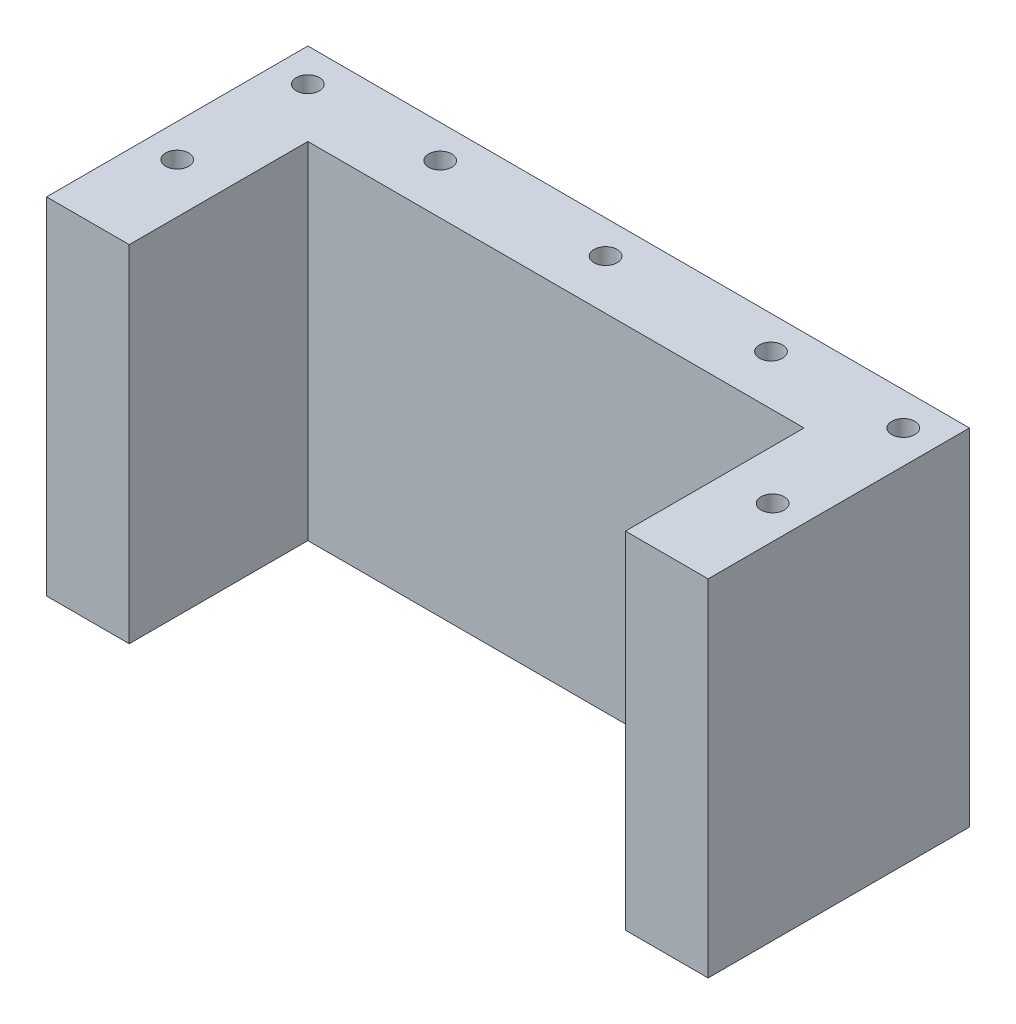
ISO-10303-21;
HEADER;
FILE_DESCRIPTION(('STEP AP214'),'2;1');
FILE_NAME('part.step','',(''),(''),'','','');
FILE_SCHEMA(('AUTOMOTIVE_DESIGN { 1 0 10303 214 1 1 1 1 }'));
ENDSEC;
DATA;
#1=APPLICATION_CONTEXT('core data for automotive mechanical design processes');
#2=APPLICATION_PROTOCOL_DEFINITION('international standard','automotive_design',2000,#1);
#3=PRODUCT_CONTEXT('',#1,'mechanical');
#4=PRODUCT('Part','Part','',(#3));
#5=PRODUCT_RELATED_PRODUCT_CATEGORY('part','',(#4));
#6=PRODUCT_DEFINITION_FORMATION('','',#4);
#7=PRODUCT_DEFINITION_CONTEXT('part definition',#1,'design');
#8=PRODUCT_DEFINITION('design','',#6,#7);
#9=PRODUCT_DEFINITION_SHAPE('','',#8);
#10=(LENGTH_UNIT() NAMED_UNIT(*) SI_UNIT(.MILLI.,.METRE.));
#11=(NAMED_UNIT(*) PLANE_ANGLE_UNIT() SI_UNIT($,.RADIAN.));
#12=(NAMED_UNIT(*) SI_UNIT($,.STERADIAN.) SOLID_ANGLE_UNIT());
#13=UNCERTAINTY_MEASURE_WITH_UNIT(LENGTH_MEASURE(1.E-05),#10,'distance_accuracy_value','');
#14=(GEOMETRIC_REPRESENTATION_CONTEXT(3) GLOBAL_UNCERTAINTY_ASSIGNED_CONTEXT((#13)) GLOBAL_UNIT_ASSIGNED_CONTEXT((#10,
#11,#12)) REPRESENTATION_CONTEXT('',''));
#15=CARTESIAN_POINT('',(0.,0.,0.));
#16=DIRECTION('',(0.,0.,1.));
#17=DIRECTION('',(1.,0.,0.));
#18=AXIS2_PLACEMENT_3D('',#15,#16,#17);
#19=CARTESIAN_POINT('',(0.,104.5,0.));
#20=DIRECTION('',(0.,-1.,0.));
#21=DIRECTION('',(0.,0.,-1.));
#22=AXIS2_PLACEMENT_3D('',#19,#20,#21);
#23=PLANE('',#22);
#24=CARTESIAN_POINT('',(90.,104.5,10.));
#25=DIRECTION('',(0.,1.,0.));
#26=DIRECTION('',(0.,0.,1.));
#27=AXIS2_PLACEMENT_3D('',#24,#25,#26);
#28=CIRCLE('',#27,3.5);
#29=CARTESIAN_POINT('',(90.,104.5,13.5));
#30=VERTEX_POINT('',#29);
#31=EDGE_CURVE('E188',#30,#30,#28,.T.);
#32=ORIENTED_EDGE('',*,*,#31,.F.);
#33=EDGE_LOOP('',(#32));
#34=FACE_BOUND('',#33,.T.);
#35=CARTESIAN_POINT('',(50.,104.5,-29.5));
#36=DIRECTION('',(0.,1.,0.));
#37=DIRECTION('',(0.,0.,1.));
#38=AXIS2_PLACEMENT_3D('',#35,#36,#37);
#39=CIRCLE('',#38,3.5);
#40=CARTESIAN_POINT('',(50.,104.5,-26.));
#41=VERTEX_POINT('',#40);
#42=EDGE_CURVE('E182',#41,#41,#39,.T.);
#43=ORIENTED_EDGE('',*,*,#42,.F.);
#44=EDGE_LOOP('',(#43));
#45=FACE_BOUND('',#44,.T.);
#46=DIRECTION('',(1.,0.,0.));
#47=VECTOR('',#46,1.);
#48=CARTESIAN_POINT('',(-100.,104.5,39.5));
#49=LINE('',#48,#47);
#50=CARTESIAN_POINT('',(-100.,104.5,39.5));
#51=VERTEX_POINT('',#50);
#52=CARTESIAN_POINT('',(-75.,104.5,39.5));
#53=VERTEX_POINT('',#52);
#54=EDGE_CURVE('E127',#51,#53,#49,.T.);
#55=ORIENTED_EDGE('',*,*,#54,.T.);
#56=DIRECTION('',(0.,0.,1.));
#57=VECTOR('',#56,1.);
#58=CARTESIAN_POINT('',(-75.,104.5,39.5));
#59=LINE('',#58,#57);
#60=CARTESIAN_POINT('',(-75.,104.5,-14.5));
#61=VERTEX_POINT('',#60);
#62=EDGE_CURVE('E97',#61,#53,#59,.T.);
#63=ORIENTED_EDGE('',*,*,#62,.F.);
#64=DIRECTION('',(-1.,0.,0.));
#65=VECTOR('',#64,1.);
#66=CARTESIAN_POINT('',(-75.,104.5,-14.5));
#67=LINE('',#66,#65);
#68=CARTESIAN_POINT('',(75.,104.5,-14.5));
#69=VERTEX_POINT('',#68);
#70=EDGE_CURVE('E112',#69,#61,#67,.T.);
#71=ORIENTED_EDGE('',*,*,#70,.F.);
#72=DIRECTION('',(0.,0.,-1.));
#73=VECTOR('',#72,1.);
#74=CARTESIAN_POINT('',(75.,104.5,39.5));
#75=LINE('',#74,#73);
#76=CARTESIAN_POINT('',(75.,104.5,39.5));
#77=VERTEX_POINT('',#76);
#78=EDGE_CURVE('E149',#77,#69,#75,.T.);
#79=ORIENTED_EDGE('',*,*,#78,.F.);
#80=CARTESIAN_POINT('',(100.,104.5,39.5));
#81=VERTEX_POINT('',#80);
#82=EDGE_CURVE('E41',#77,#81,#49,.T.);
#83=ORIENTED_EDGE('',*,*,#82,.T.);
#84=DIRECTION('',(0.,0.,-1.));
#85=VECTOR('',#84,1.);
#86=CARTESIAN_POINT('',(100.,104.5,39.5));
#87=LINE('',#86,#85);
#88=CARTESIAN_POINT('',(100.,104.5,-39.5));
#89=VERTEX_POINT('',#88);
#90=EDGE_CURVE('E118',#81,#89,#87,.T.);
#91=ORIENTED_EDGE('',*,*,#90,.T.);
#92=DIRECTION('',(-1.,0.,0.));
#93=VECTOR('',#92,1.);
#94=CARTESIAN_POINT('',(-100.,104.5,-39.5));
#95=LINE('',#94,#93);
#96=CARTESIAN_POINT('',(-100.,104.5,-39.5));
#97=VERTEX_POINT('',#96);
#98=EDGE_CURVE('E70',#89,#97,#95,.T.);
#99=ORIENTED_EDGE('',*,*,#98,.T.);
#100=DIRECTION('',(0.,0.,1.));
#101=VECTOR('',#100,1.);
#102=CARTESIAN_POINT('',(-100.,104.5,39.5));
#103=LINE('',#102,#101);
#104=EDGE_CURVE('E132',#97,#51,#103,.T.);
#105=ORIENTED_EDGE('',*,*,#104,.T.);
#106=EDGE_LOOP('',(#55,#63,#71,#79,#83,#91,#99,#105));
#107=FACE_BOUND('',#106,.T.);
#108=CARTESIAN_POINT('',(-90.,104.5,10.));
#109=DIRECTION('',(0.,1.,0.));
#110=DIRECTION('',(0.,0.,1.));
#111=AXIS2_PLACEMENT_3D('',#108,#109,#110);
#112=CIRCLE('',#111,3.5);
#113=CARTESIAN_POINT('',(-90.,104.5,13.5));
#114=VERTEX_POINT('',#113);
#115=EDGE_CURVE('E158',#114,#114,#112,.T.);
#116=ORIENTED_EDGE('',*,*,#115,.F.);
#117=EDGE_LOOP('',(#116));
#118=FACE_BOUND('',#117,.T.);
#119=CARTESIAN_POINT('',(-90.,104.5,-29.5));
#120=DIRECTION('',(0.,1.,0.));
#121=DIRECTION('',(0.,0.,1.));
#122=AXIS2_PLACEMENT_3D('',#119,#120,#121);
#123=CIRCLE('',#122,3.5);
#124=CARTESIAN_POINT('',(-90.,104.5,-26.));
#125=VERTEX_POINT('',#124);
#126=EDGE_CURVE('E164',#125,#125,#123,.T.);
#127=ORIENTED_EDGE('',*,*,#126,.F.);
#128=EDGE_LOOP('',(#127));
#129=FACE_BOUND('',#128,.T.);
#130=CARTESIAN_POINT('',(-50.,104.5,-29.5));
#131=DIRECTION('',(0.,1.,0.));
#132=DIRECTION('',(0.,0.,1.));
#133=AXIS2_PLACEMENT_3D('',#130,#131,#132);
#134=CIRCLE('',#133,3.5);
#135=CARTESIAN_POINT('',(-50.,104.5,-26.));
#136=VERTEX_POINT('',#135);
#137=EDGE_CURVE('E170',#136,#136,#134,.T.);
#138=ORIENTED_EDGE('',*,*,#137,.F.);
#139=EDGE_LOOP('',(#138));
#140=FACE_BOUND('',#139,.T.);
#141=CARTESIAN_POINT('',(0.,104.5,-29.5));
#142=DIRECTION('',(0.,1.,0.));
#143=DIRECTION('',(0.,0.,1.));
#144=AXIS2_PLACEMENT_3D('',#141,#142,#143);
#145=CIRCLE('',#144,3.5);
#146=CARTESIAN_POINT('',(0.,104.5,-26.));
#147=VERTEX_POINT('',#146);
#148=EDGE_CURVE('E176',#147,#147,#145,.T.);
#149=ORIENTED_EDGE('',*,*,#148,.F.);
#150=EDGE_LOOP('',(#149));
#151=FACE_BOUND('',#150,.T.);
#152=CARTESIAN_POINT('',(90.,104.5,-29.5));
#153=DIRECTION('',(0.,1.,0.));
#154=DIRECTION('',(0.,0.,1.));
#155=AXIS2_PLACEMENT_3D('',#152,#153,#154);
#156=CIRCLE('',#155,3.5);
#157=CARTESIAN_POINT('',(90.,104.5,-26.));
#158=VERTEX_POINT('',#157);
#159=EDGE_CURVE('E194',#158,#158,#156,.T.);
#160=ORIENTED_EDGE('',*,*,#159,.F.);
#161=EDGE_LOOP('',(#160));
#162=FACE_BOUND('',#161,.T.);
#163=ADVANCED_FACE('F17',(#34,#45,#107,#118,#129,#140,#151,#162),#23,.F.);
#164=CARTESIAN_POINT('',(0.,0.,0.));
#165=DIRECTION('',(0.,-1.,0.));
#166=DIRECTION('',(0.,0.,-1.));
#167=AXIS2_PLACEMENT_3D('',#164,#165,#166);
#168=PLANE('',#167);
#169=CARTESIAN_POINT('',(90.,0.,-29.5));
#170=DIRECTION('',(0.,1.,0.));
#171=DIRECTION('',(0.,0.,1.));
#172=AXIS2_PLACEMENT_3D('',#169,#170,#171);
#173=CIRCLE('',#172,3.5);
#174=CARTESIAN_POINT('',(90.,0.,-26.));
#175=VERTEX_POINT('',#174);
#176=EDGE_CURVE('E191',#175,#175,#173,.T.);
#177=ORIENTED_EDGE('',*,*,#176,.T.);
#178=EDGE_LOOP('',(#177));
#179=FACE_BOUND('',#178,.T.);
#180=CARTESIAN_POINT('',(50.,0.,-29.5));
#181=DIRECTION('',(0.,1.,0.));
#182=DIRECTION('',(0.,0.,1.));
#183=AXIS2_PLACEMENT_3D('',#180,#181,#182);
#184=CIRCLE('',#183,3.5);
#185=CARTESIAN_POINT('',(50.,0.,-26.));
#186=VERTEX_POINT('',#185);
#187=EDGE_CURVE('E179',#186,#186,#184,.T.);
#188=ORIENTED_EDGE('',*,*,#187,.T.);
#189=EDGE_LOOP('',(#188));
#190=FACE_BOUND('',#189,.T.);
#191=CARTESIAN_POINT('',(0.,0.,-29.5));
#192=DIRECTION('',(0.,1.,0.));
#193=DIRECTION('',(0.,0.,1.));
#194=AXIS2_PLACEMENT_3D('',#191,#192,#193);
#195=CIRCLE('',#194,3.5);
#196=CARTESIAN_POINT('',(0.,0.,-26.));
#197=VERTEX_POINT('',#196);
#198=EDGE_CURVE('E173',#197,#197,#195,.T.);
#199=ORIENTED_EDGE('',*,*,#198,.T.);
#200=EDGE_LOOP('',(#199));
#201=FACE_BOUND('',#200,.T.);
#202=DIRECTION('',(0.,0.,1.));
#203=VECTOR('',#202,1.);
#204=CARTESIAN_POINT('',(-75.,0.,39.5));
#205=LINE('',#204,#203);
#206=CARTESIAN_POINT('',(-75.,0.,-14.5));
#207=VERTEX_POINT('',#206);
#208=CARTESIAN_POINT('',(-75.,0.,39.5));
#209=VERTEX_POINT('',#208);
#210=EDGE_CURVE('E95',#207,#209,#205,.T.);
#211=ORIENTED_EDGE('',*,*,#210,.T.);
#212=DIRECTION('',(1.,0.,0.));
#213=VECTOR('',#212,1.);
#214=CARTESIAN_POINT('',(-100.,0.,39.5));
#215=LINE('',#214,#213);
#216=CARTESIAN_POINT('',(-100.,0.,39.5));
#217=VERTEX_POINT('',#216);
#218=EDGE_CURVE('E109',#217,#209,#215,.T.);
#219=ORIENTED_EDGE('',*,*,#218,.F.);
#220=DIRECTION('',(0.,0.,1.));
#221=VECTOR('',#220,1.);
#222=CARTESIAN_POINT('',(-100.,0.,39.5));
#223=LINE('',#222,#221);
#224=CARTESIAN_POINT('',(-100.,0.,-39.5));
#225=VERTEX_POINT('',#224);
#226=EDGE_CURVE('E121',#225,#217,#223,.T.);
#227=ORIENTED_EDGE('',*,*,#226,.F.);
#228=DIRECTION('',(-1.,0.,0.));
#229=VECTOR('',#228,1.);
#230=CARTESIAN_POINT('',(-100.,0.,-39.5));
#231=LINE('',#230,#229);
#232=CARTESIAN_POINT('',(100.,0.,-39.5));
#233=VERTEX_POINT('',#232);
#234=EDGE_CURVE('E134',#233,#225,#231,.T.);
#235=ORIENTED_EDGE('',*,*,#234,.F.);
#236=DIRECTION('',(0.,0.,-1.));
#237=VECTOR('',#236,1.);
#238=CARTESIAN_POINT('',(100.,0.,39.5));
#239=LINE('',#238,#237);
#240=CARTESIAN_POINT('',(100.,0.,39.5));
#241=VERTEX_POINT('',#240);
#242=EDGE_CURVE('E135',#241,#233,#239,.T.);
#243=ORIENTED_EDGE('',*,*,#242,.F.);
#244=CARTESIAN_POINT('',(75.,0.,39.5));
#245=VERTEX_POINT('',#244);
#246=EDGE_CURVE('E63',#245,#241,#215,.T.);
#247=ORIENTED_EDGE('',*,*,#246,.F.);
#248=DIRECTION('',(0.,0.,-1.));
#249=VECTOR('',#248,1.);
#250=CARTESIAN_POINT('',(75.,0.,39.5));
#251=LINE('',#250,#249);
#252=CARTESIAN_POINT('',(75.,0.,-14.5));
#253=VERTEX_POINT('',#252);
#254=EDGE_CURVE('E111',#245,#253,#251,.T.);
#255=ORIENTED_EDGE('',*,*,#254,.T.);
#256=DIRECTION('',(-1.,0.,0.));
#257=VECTOR('',#256,1.);
#258=CARTESIAN_POINT('',(-75.,0.,-14.5));
#259=LINE('',#258,#257);
#260=EDGE_CURVE('E32',#253,#207,#259,.T.);
#261=ORIENTED_EDGE('',*,*,#260,.T.);
#262=EDGE_LOOP('',(#211,#219,#227,#235,#243,#247,#255,#261));
#263=FACE_BOUND('',#262,.T.);
#264=CARTESIAN_POINT('',(-90.,0.,10.));
#265=DIRECTION('',(0.,1.,0.));
#266=DIRECTION('',(0.,0.,1.));
#267=AXIS2_PLACEMENT_3D('',#264,#265,#266);
#268=CIRCLE('',#267,3.5);
#269=CARTESIAN_POINT('',(-90.,0.,13.5));
#270=VERTEX_POINT('',#269);
#271=EDGE_CURVE('E153',#270,#270,#268,.T.);
#272=ORIENTED_EDGE('',*,*,#271,.T.);
#273=EDGE_LOOP('',(#272));
#274=FACE_BOUND('',#273,.T.);
#275=CARTESIAN_POINT('',(-90.,0.,-29.5));
#276=DIRECTION('',(0.,1.,0.));
#277=DIRECTION('',(0.,0.,1.));
#278=AXIS2_PLACEMENT_3D('',#275,#276,#277);
#279=CIRCLE('',#278,3.5);
#280=CARTESIAN_POINT('',(-90.,0.,-26.));
#281=VERTEX_POINT('',#280);
#282=EDGE_CURVE('E161',#281,#281,#279,.T.);
#283=ORIENTED_EDGE('',*,*,#282,.T.);
#284=EDGE_LOOP('',(#283));
#285=FACE_BOUND('',#284,.T.);
#286=CARTESIAN_POINT('',(-50.,0.,-29.5));
#287=DIRECTION('',(0.,1.,0.));
#288=DIRECTION('',(0.,0.,1.));
#289=AXIS2_PLACEMENT_3D('',#286,#287,#288);
#290=CIRCLE('',#289,3.5);
#291=CARTESIAN_POINT('',(-50.,0.,-26.));
#292=VERTEX_POINT('',#291);
#293=EDGE_CURVE('E167',#292,#292,#290,.T.);
#294=ORIENTED_EDGE('',*,*,#293,.T.);
#295=EDGE_LOOP('',(#294));
#296=FACE_BOUND('',#295,.T.);
#297=CARTESIAN_POINT('',(90.,0.,10.));
#298=DIRECTION('',(0.,1.,0.));
#299=DIRECTION('',(0.,0.,1.));
#300=AXIS2_PLACEMENT_3D('',#297,#298,#299);
#301=CIRCLE('',#300,3.5);
#302=CARTESIAN_POINT('',(90.,0.,13.5));
#303=VERTEX_POINT('',#302);
#304=EDGE_CURVE('E185',#303,#303,#301,.T.);
#305=ORIENTED_EDGE('',*,*,#304,.T.);
#306=EDGE_LOOP('',(#305));
#307=FACE_BOUND('',#306,.T.);
#308=ADVANCED_FACE('F106',(#179,#190,#201,#263,#274,#285,#296,#307),#168,.T.);
#309=CARTESIAN_POINT('',(-100.,104.5,39.5));
#310=DIRECTION('',(0.,0.,-1.));
#311=DIRECTION('',(-1.,0.,0.));
#312=AXIS2_PLACEMENT_3D('',#309,#310,#311);
#313=PLANE('',#312);
#314=ORIENTED_EDGE('',*,*,#218,.T.);
#315=DIRECTION('',(0.,1.,0.));
#316=VECTOR('',#315,1.);
#317=CARTESIAN_POINT('',(-75.,0.,39.5));
#318=LINE('',#317,#316);
#319=EDGE_CURVE('E92',#209,#53,#318,.T.);
#320=ORIENTED_EDGE('',*,*,#319,.T.);
#321=ORIENTED_EDGE('',*,*,#54,.F.);
#322=DIRECTION('',(0.,-1.,0.));
#323=VECTOR('',#322,1.);
#324=CARTESIAN_POINT('',(-100.,104.5,39.5));
#325=LINE('',#324,#323);
#326=EDGE_CURVE('E117',#51,#217,#325,.T.);
#327=ORIENTED_EDGE('',*,*,#326,.T.);
#328=EDGE_LOOP('',(#314,#320,#321,#327));
#329=FACE_BOUND('',#328,.T.);
#330=ADVANCED_FACE('F115',(#329),#313,.F.);
#331=CARTESIAN_POINT('',(100.,104.5,39.5));
#332=DIRECTION('',(-1.,0.,0.));
#333=DIRECTION('',(0.,0.,1.));
#334=AXIS2_PLACEMENT_3D('',#331,#332,#333);
#335=PLANE('',#334);
#336=ORIENTED_EDGE('',*,*,#242,.T.);
#337=DIRECTION('',(0.,-1.,0.));
#338=VECTOR('',#337,1.);
#339=CARTESIAN_POINT('',(100.,104.5,-39.5));
#340=LINE('',#339,#338);
#341=EDGE_CURVE('E11',#89,#233,#340,.T.);
#342=ORIENTED_EDGE('',*,*,#341,.F.);
#343=ORIENTED_EDGE('',*,*,#90,.F.);
#344=DIRECTION('',(0.,-1.,0.));
#345=VECTOR('',#344,1.);
#346=CARTESIAN_POINT('',(100.,104.5,39.5));
#347=LINE('',#346,#345);
#348=EDGE_CURVE('E125',#81,#241,#347,.T.);
#349=ORIENTED_EDGE('',*,*,#348,.T.);
#350=EDGE_LOOP('',(#336,#342,#343,#349));
#351=FACE_BOUND('',#350,.T.);
#352=ADVANCED_FACE('F19',(#351),#335,.F.);
#353=CARTESIAN_POINT('',(-100.,104.5,-39.5));
#354=DIRECTION('',(0.,0.,1.));
#355=DIRECTION('',(1.,0.,0.));
#356=AXIS2_PLACEMENT_3D('',#353,#354,#355);
#357=PLANE('',#356);
#358=ORIENTED_EDGE('',*,*,#234,.T.);
#359=DIRECTION('',(0.,-1.,0.));
#360=VECTOR('',#359,1.);
#361=CARTESIAN_POINT('',(-100.,104.5,-39.5));
#362=LINE('',#361,#360);
#363=EDGE_CURVE('E25',#97,#225,#362,.T.);
#364=ORIENTED_EDGE('',*,*,#363,.F.);
#365=ORIENTED_EDGE('',*,*,#98,.F.);
#366=ORIENTED_EDGE('',*,*,#341,.T.);
#367=EDGE_LOOP('',(#358,#364,#365,#366));
#368=FACE_BOUND('',#367,.T.);
#369=ADVANCED_FACE('F219',(#368),#357,.F.);
#370=CARTESIAN_POINT('',(-100.,104.5,39.5));
#371=DIRECTION('',(1.,0.,0.));
#372=DIRECTION('',(0.,0.,-1.));
#373=AXIS2_PLACEMENT_3D('',#370,#371,#372);
#374=PLANE('',#373);
#375=ORIENTED_EDGE('',*,*,#226,.T.);
#376=ORIENTED_EDGE('',*,*,#326,.F.);
#377=ORIENTED_EDGE('',*,*,#104,.F.);
#378=ORIENTED_EDGE('',*,*,#363,.T.);
#379=EDGE_LOOP('',(#375,#376,#377,#378));
#380=FACE_BOUND('',#379,.T.);
#381=ADVANCED_FACE('F131',(#380),#374,.F.);
#382=ORIENTED_EDGE('',*,*,#82,.F.);
#383=DIRECTION('',(0.,1.,0.));
#384=VECTOR('',#383,1.);
#385=CARTESIAN_POINT('',(75.,0.,39.5));
#386=LINE('',#385,#384);
#387=EDGE_CURVE('E102',#245,#77,#386,.T.);
#388=ORIENTED_EDGE('',*,*,#387,.F.);
#389=ORIENTED_EDGE('',*,*,#246,.T.);
#390=ORIENTED_EDGE('',*,*,#348,.F.);
#391=EDGE_LOOP('',(#382,#388,#389,#390));
#392=FACE_BOUND('',#391,.T.);
#393=ADVANCED_FACE('F215',(#392),#313,.F.);
#394=CARTESIAN_POINT('',(-75.,0.,39.5));
#395=DIRECTION('',(-1.,0.,0.));
#396=DIRECTION('',(0.,0.,1.));
#397=AXIS2_PLACEMENT_3D('',#394,#395,#396);
#398=PLANE('',#397);
#399=ORIENTED_EDGE('',*,*,#62,.T.);
#400=ORIENTED_EDGE('',*,*,#319,.F.);
#401=ORIENTED_EDGE('',*,*,#210,.F.);
#402=DIRECTION('',(0.,1.,0.));
#403=VECTOR('',#402,1.);
#404=CARTESIAN_POINT('',(-75.,0.,-14.5));
#405=LINE('',#404,#403);
#406=EDGE_CURVE('E137',#207,#61,#405,.T.);
#407=ORIENTED_EDGE('',*,*,#406,.T.);
#408=EDGE_LOOP('',(#399,#400,#401,#407));
#409=FACE_BOUND('',#408,.T.);
#410=ADVANCED_FACE('F94',(#409),#398,.F.);
#411=CARTESIAN_POINT('',(-75.,0.,-14.5));
#412=DIRECTION('',(0.,0.,-1.));
#413=DIRECTION('',(-1.,0.,0.));
#414=AXIS2_PLACEMENT_3D('',#411,#412,#413);
#415=PLANE('',#414);
#416=ORIENTED_EDGE('',*,*,#70,.T.);
#417=ORIENTED_EDGE('',*,*,#406,.F.);
#418=ORIENTED_EDGE('',*,*,#260,.F.);
#419=DIRECTION('',(0.,1.,0.));
#420=VECTOR('',#419,1.);
#421=CARTESIAN_POINT('',(75.,0.,-14.5));
#422=LINE('',#421,#420);
#423=EDGE_CURVE('E144',#253,#69,#422,.T.);
#424=ORIENTED_EDGE('',*,*,#423,.T.);
#425=EDGE_LOOP('',(#416,#417,#418,#424));
#426=FACE_BOUND('',#425,.T.);
#427=ADVANCED_FACE('F236',(#426),#415,.F.);
#428=CARTESIAN_POINT('',(75.,0.,39.5));
#429=DIRECTION('',(1.,0.,0.));
#430=DIRECTION('',(0.,0.,-1.));
#431=AXIS2_PLACEMENT_3D('',#428,#429,#430);
#432=PLANE('',#431);
#433=ORIENTED_EDGE('',*,*,#78,.T.);
#434=ORIENTED_EDGE('',*,*,#423,.F.);
#435=ORIENTED_EDGE('',*,*,#254,.F.);
#436=ORIENTED_EDGE('',*,*,#387,.T.);
#437=EDGE_LOOP('',(#433,#434,#435,#436));
#438=FACE_BOUND('',#437,.T.);
#439=ADVANCED_FACE('F233',(#438),#432,.F.);
#440=CARTESIAN_POINT('',(-90.,104.5,10.));
#441=DIRECTION('',(0.,1.,0.));
#442=DIRECTION('',(0.,0.,1.));
#443=AXIS2_PLACEMENT_3D('',#440,#441,#442);
#444=CYLINDRICAL_SURFACE('',#443,3.5);
#445=ORIENTED_EDGE('',*,*,#271,.F.);
#446=EDGE_LOOP('',(#445));
#447=FACE_BOUND('',#446,.T.);
#448=ORIENTED_EDGE('',*,*,#115,.T.);
#449=EDGE_LOOP('',(#448));
#450=FACE_BOUND('',#449,.T.);
#451=ADVANCED_FACE('F244',(#447,#450),#444,.F.);
#452=CARTESIAN_POINT('',(-90.,104.5,-29.5));
#453=DIRECTION('',(0.,1.,0.));
#454=DIRECTION('',(0.,0.,1.));
#455=AXIS2_PLACEMENT_3D('',#452,#453,#454);
#456=CYLINDRICAL_SURFACE('',#455,3.5);
#457=ORIENTED_EDGE('',*,*,#282,.F.);
#458=EDGE_LOOP('',(#457));
#459=FACE_BOUND('',#458,.T.);
#460=ORIENTED_EDGE('',*,*,#126,.T.);
#461=EDGE_LOOP('',(#460));
#462=FACE_BOUND('',#461,.T.);
#463=ADVANCED_FACE('F248',(#459,#462),#456,.F.);
#464=CARTESIAN_POINT('',(-50.,104.5,-29.5));
#465=DIRECTION('',(0.,1.,0.));
#466=DIRECTION('',(0.,0.,1.));
#467=AXIS2_PLACEMENT_3D('',#464,#465,#466);
#468=CYLINDRICAL_SURFACE('',#467,3.5);
#469=ORIENTED_EDGE('',*,*,#293,.F.);
#470=EDGE_LOOP('',(#469));
#471=FACE_BOUND('',#470,.T.);
#472=ORIENTED_EDGE('',*,*,#137,.T.);
#473=EDGE_LOOP('',(#472));
#474=FACE_BOUND('',#473,.T.);
#475=ADVANCED_FACE('F252',(#471,#474),#468,.F.);
#476=CARTESIAN_POINT('',(0.,104.5,-29.5));
#477=DIRECTION('',(0.,1.,0.));
#478=DIRECTION('',(0.,0.,1.));
#479=AXIS2_PLACEMENT_3D('',#476,#477,#478);
#480=CYLINDRICAL_SURFACE('',#479,3.5);
#481=ORIENTED_EDGE('',*,*,#198,.F.);
#482=EDGE_LOOP('',(#481));
#483=FACE_BOUND('',#482,.T.);
#484=ORIENTED_EDGE('',*,*,#148,.T.);
#485=EDGE_LOOP('',(#484));
#486=FACE_BOUND('',#485,.T.);
#487=ADVANCED_FACE('F256',(#483,#486),#480,.F.);
#488=CARTESIAN_POINT('',(50.,104.5,-29.5));
#489=DIRECTION('',(0.,1.,0.));
#490=DIRECTION('',(0.,0.,1.));
#491=AXIS2_PLACEMENT_3D('',#488,#489,#490);
#492=CYLINDRICAL_SURFACE('',#491,3.5);
#493=ORIENTED_EDGE('',*,*,#187,.F.);
#494=EDGE_LOOP('',(#493));
#495=FACE_BOUND('',#494,.T.);
#496=ORIENTED_EDGE('',*,*,#42,.T.);
#497=EDGE_LOOP('',(#496));
#498=FACE_BOUND('',#497,.T.);
#499=ADVANCED_FACE('F260',(#495,#498),#492,.F.);
#500=CARTESIAN_POINT('',(90.,104.5,10.));
#501=DIRECTION('',(0.,1.,0.));
#502=DIRECTION('',(0.,0.,1.));
#503=AXIS2_PLACEMENT_3D('',#500,#501,#502);
#504=CYLINDRICAL_SURFACE('',#503,3.5);
#505=ORIENTED_EDGE('',*,*,#304,.F.);
#506=EDGE_LOOP('',(#505));
#507=FACE_BOUND('',#506,.T.);
#508=ORIENTED_EDGE('',*,*,#31,.T.);
#509=EDGE_LOOP('',(#508));
#510=FACE_BOUND('',#509,.T.);
#511=ADVANCED_FACE('F264',(#507,#510),#504,.F.);
#512=CARTESIAN_POINT('',(90.,104.5,-29.5));
#513=DIRECTION('',(0.,1.,0.));
#514=DIRECTION('',(0.,0.,1.));
#515=AXIS2_PLACEMENT_3D('',#512,#513,#514);
#516=CYLINDRICAL_SURFACE('',#515,3.5);
#517=ORIENTED_EDGE('',*,*,#176,.F.);
#518=EDGE_LOOP('',(#517));
#519=FACE_BOUND('',#518,.T.);
#520=ORIENTED_EDGE('',*,*,#159,.T.);
#521=EDGE_LOOP('',(#520));
#522=FACE_BOUND('',#521,.T.);
#523=ADVANCED_FACE('F198',(#519,#522),#516,.F.);
#524=CLOSED_SHELL('',(#163,#308,#330,#352,#369,#381,#393,#410,#427,#439,#451,#463,#475,#487,
#499,#511,#523));
#525=MANIFOLD_SOLID_BREP('B1',#524);
#526=ADVANCED_BREP_SHAPE_REPRESENTATION('',(#18,#525),#14);
#527=SHAPE_DEFINITION_REPRESENTATION(#9,#526);
ENDSEC;
END-ISO-10303-21;
